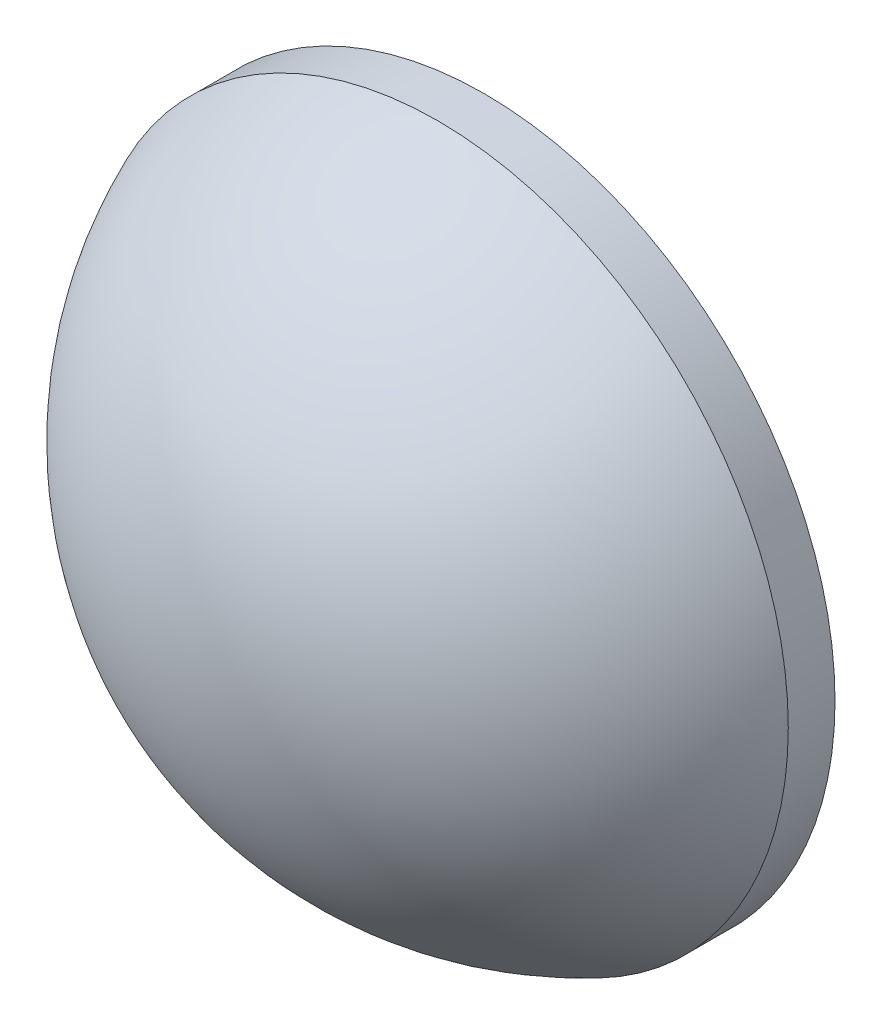
ISO-10303-21;
HEADER;
FILE_DESCRIPTION(('STEP AP214'),'2;1');
FILE_NAME('part.step','',(''),(''),'','','');
FILE_SCHEMA(('AUTOMOTIVE_DESIGN { 1 0 10303 214 1 1 1 1 }'));
ENDSEC;
DATA;
#1=APPLICATION_CONTEXT('core data for automotive mechanical design processes');
#2=APPLICATION_PROTOCOL_DEFINITION('international standard','automotive_design',2000,#1);
#3=PRODUCT_CONTEXT('',#1,'mechanical');
#4=PRODUCT('Part','Part','',(#3));
#5=PRODUCT_RELATED_PRODUCT_CATEGORY('part','',(#4));
#6=PRODUCT_DEFINITION_FORMATION('','',#4);
#7=PRODUCT_DEFINITION_CONTEXT('part definition',#1,'design');
#8=PRODUCT_DEFINITION('design','',#6,#7);
#9=PRODUCT_DEFINITION_SHAPE('','',#8);
#10=(LENGTH_UNIT() NAMED_UNIT(*) SI_UNIT(.MILLI.,.METRE.));
#11=(NAMED_UNIT(*) PLANE_ANGLE_UNIT() SI_UNIT($,.RADIAN.));
#12=(NAMED_UNIT(*) SI_UNIT($,.STERADIAN.) SOLID_ANGLE_UNIT());
#13=UNCERTAINTY_MEASURE_WITH_UNIT(LENGTH_MEASURE(1.E-05),#10,'distance_accuracy_value','');
#14=(GEOMETRIC_REPRESENTATION_CONTEXT(3) GLOBAL_UNCERTAINTY_ASSIGNED_CONTEXT((#13)) GLOBAL_UNIT_ASSIGNED_CONTEXT((#10,
#11,#12)) REPRESENTATION_CONTEXT('',''));
#15=CARTESIAN_POINT('',(0.,0.,0.));
#16=DIRECTION('',(0.,0.,1.));
#17=DIRECTION('',(1.,0.,0.));
#18=AXIS2_PLACEMENT_3D('',#15,#16,#17);
#19=CARTESIAN_POINT('',(-3.03239809928258,0.55144274378174,1.));
#20=DIRECTION('',(0.,0.,-1.));
#21=DIRECTION('',(-1.,0.,0.));
#22=AXIS2_PLACEMENT_3D('',#19,#20,#21);
#23=CYLINDRICAL_SURFACE('',#22,7.5);
#24=CARTESIAN_POINT('',(-3.03239809928258,0.55144274378174,1.));
#25=DIRECTION('',(0.,0.,1.));
#26=DIRECTION('',(1.,0.,0.));
#27=AXIS2_PLACEMENT_3D('',#24,#25,#26);
#28=CIRCLE('',#27,7.5);
#29=CARTESIAN_POINT('',(4.46760190071742,0.55144274378174,1.));
#30=VERTEX_POINT('',#29);
#31=EDGE_CURVE('E10',#30,#30,#28,.T.);
#32=ORIENTED_EDGE('',*,*,#31,.F.);
#33=EDGE_LOOP('',(#32));
#34=FACE_BOUND('',#33,.T.);
#35=CARTESIAN_POINT('',(-3.03239809928258,0.55144274378174,0.));
#36=DIRECTION('',(0.,0.,1.));
#37=DIRECTION('',(1.,0.,0.));
#38=AXIS2_PLACEMENT_3D('',#35,#36,#37);
#39=CIRCLE('',#38,7.5);
#40=CARTESIAN_POINT('',(4.46760190071742,0.55144274378174,0.));
#41=VERTEX_POINT('',#40);
#42=EDGE_CURVE('E40',#41,#41,#39,.T.);
#43=ORIENTED_EDGE('',*,*,#42,.T.);
#44=EDGE_LOOP('',(#43));
#45=FACE_BOUND('',#44,.T.);
#46=ADVANCED_FACE('F33',(#34,#45),#23,.T.);
#47=CARTESIAN_POINT('',(-3.03239809928258,0.55144274378174,-2.125));
#48=DIRECTION('',(0.,0.,1.));
#49=DIRECTION('',(1.,0.,0.));
#50=AXIS2_PLACEMENT_3D('',#47,#48,#49);
#51=SPHERICAL_SURFACE('',#50,8.125);
#52=ORIENTED_EDGE('',*,*,#31,.T.);
#53=EDGE_LOOP('',(#52));
#54=FACE_BOUND('',#53,.T.);
#55=ADVANCED_FACE('F35',(#54),#51,.T.);
#56=CARTESIAN_POINT('',(-3.03239809928258,0.55144274378174,0.));
#57=DIRECTION('',(0.,0.,1.));
#58=DIRECTION('',(1.,0.,0.));
#59=AXIS2_PLACEMENT_3D('',#56,#57,#58);
#60=PLANE('',#59);
#61=ORIENTED_EDGE('',*,*,#42,.F.);
#62=EDGE_LOOP('',(#61));
#63=FACE_BOUND('',#62,.T.);
#64=ADVANCED_FACE('F47',(#63),#60,.F.);
#65=CLOSED_SHELL('',(#46,#55,#64));
#66=MANIFOLD_SOLID_BREP('B2',#65);
#67=ADVANCED_BREP_SHAPE_REPRESENTATION('',(#18,#66),#14);
#68=SHAPE_DEFINITION_REPRESENTATION(#9,#67);
ENDSEC;
END-ISO-10303-21;
